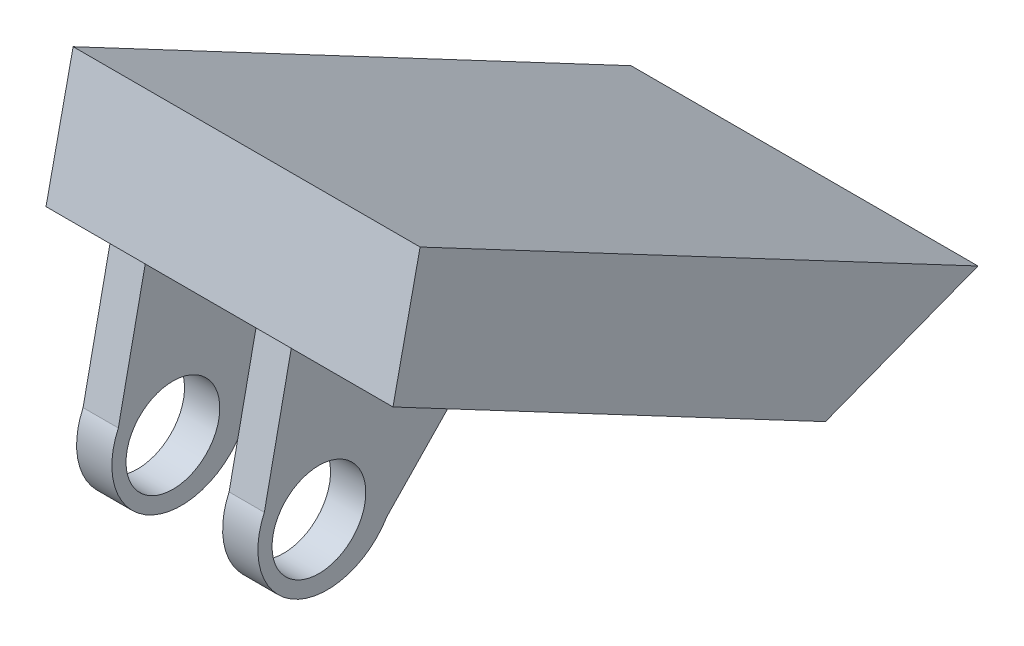
ISO-10303-21;
HEADER;
FILE_DESCRIPTION(('STEP AP214'),'2;1');
FILE_NAME('part.step','',(''),(''),'','','');
FILE_SCHEMA(('AUTOMOTIVE_DESIGN { 1 0 10303 214 1 1 1 1 }'));
ENDSEC;
DATA;
#1=APPLICATION_CONTEXT('core data for automotive mechanical design processes');
#2=APPLICATION_PROTOCOL_DEFINITION('international standard','automotive_design',2000,#1);
#3=PRODUCT_CONTEXT('',#1,'mechanical');
#4=PRODUCT('Part','Part','',(#3));
#5=PRODUCT_RELATED_PRODUCT_CATEGORY('part','',(#4));
#6=PRODUCT_DEFINITION_FORMATION('','',#4);
#7=PRODUCT_DEFINITION_CONTEXT('part definition',#1,'design');
#8=PRODUCT_DEFINITION('design','',#6,#7);
#9=PRODUCT_DEFINITION_SHAPE('','',#8);
#10=(LENGTH_UNIT() NAMED_UNIT(*) SI_UNIT(.MILLI.,.METRE.));
#11=(NAMED_UNIT(*) PLANE_ANGLE_UNIT() SI_UNIT($,.RADIAN.));
#12=(NAMED_UNIT(*) SI_UNIT($,.STERADIAN.) SOLID_ANGLE_UNIT());
#13=UNCERTAINTY_MEASURE_WITH_UNIT(LENGTH_MEASURE(1.E-05),#10,'distance_accuracy_value','');
#14=(GEOMETRIC_REPRESENTATION_CONTEXT(3) GLOBAL_UNCERTAINTY_ASSIGNED_CONTEXT((#13)) GLOBAL_UNIT_ASSIGNED_CONTEXT((#10,
#11,#12)) REPRESENTATION_CONTEXT('',''));
#15=CARTESIAN_POINT('',(0.,0.,0.));
#16=DIRECTION('',(0.,0.,1.));
#17=DIRECTION('',(1.,0.,0.));
#18=AXIS2_PLACEMENT_3D('',#15,#16,#17);
#19=CARTESIAN_POINT('',(140.024612,98.6155,-342.20531));
#20=DIRECTION('',(0.,0.883778488963269,-0.467905527265709));
#21=DIRECTION('',(0.,0.467905527265709,0.883778488963269));
#22=AXIS2_PLACEMENT_3D('',#19,#20,#21);
#23=PLANE('',#22);
#24=DIRECTION('',(0.,-0.467905527265709,-0.883778488963269));
#25=VECTOR('',#24,1.);
#26=CARTESIAN_POINT('',(119.09933,98.6155,-342.20531));
#27=LINE('',#26,#25);
#28=CARTESIAN_POINT('',(119.09933,136.241261767103,-271.137889456923));
#29=VERTEX_POINT('',#28);
#30=CARTESIAN_POINT('',(119.09933,118.763451398877,-304.149922736258));
#31=VERTEX_POINT('',#30);
#32=EDGE_CURVE('E40',#29,#31,#27,.T.);
#33=ORIENTED_EDGE('',*,*,#32,.T.);
#34=DIRECTION('',(-1.,0.,0.));
#35=VECTOR('',#34,1.);
#36=CARTESIAN_POINT('',(140.024612,118.763451398845,-304.149922736184));
#37=LINE('',#36,#35);
#38=CARTESIAN_POINT('',(113.00714,118.763451398877,-304.149922736258));
#39=VERTEX_POINT('',#38);
#40=EDGE_CURVE('E11',#31,#39,#37,.T.);
#41=ORIENTED_EDGE('',*,*,#40,.T.);
#42=DIRECTION('',(0.,-0.467905527265709,-0.883778488963269));
#43=VECTOR('',#42,1.);
#44=CARTESIAN_POINT('',(113.00714,98.6155,-342.20531));
#45=LINE('',#44,#43);
#46=CARTESIAN_POINT('',(113.00714,136.241261767111,-271.137889456938));
#47=VERTEX_POINT('',#46);
#48=EDGE_CURVE('E213',#47,#39,#45,.T.);
#49=ORIENTED_EDGE('',*,*,#48,.F.);
#50=DIRECTION('',(1.,0.,0.));
#51=VECTOR('',#50,1.);
#52=CARTESIAN_POINT('',(140.024612,136.241261767103,-271.137889456923));
#53=LINE('',#52,#51);
#54=EDGE_CURVE('E210',#47,#29,#53,.T.);
#55=ORIENTED_EDGE('',*,*,#54,.T.);
#56=EDGE_LOOP('',(#33,#41,#49,#55));
#57=FACE_BOUND('',#56,.T.);
#58=DIRECTION('',(0.,-0.467905527265709,-0.883778488963269));
#59=VECTOR('',#58,1.);
#60=CARTESIAN_POINT('',(80.083152,98.6155,-342.20531));
#61=LINE('',#60,#59);
#62=CARTESIAN_POINT('',(80.083152,138.173968,-267.4874));
#63=VERTEX_POINT('',#62);
#64=CARTESIAN_POINT('',(80.083152,98.6155,-342.20531));
#65=VERTEX_POINT('',#64);
#66=EDGE_CURVE('E171',#63,#65,#61,.T.);
#67=ORIENTED_EDGE('',*,*,#66,.T.);
#68=DIRECTION('',(-1.,0.,0.));
#69=VECTOR('',#68,1.);
#70=CARTESIAN_POINT('',(140.024612,98.6155,-342.20531));
#71=LINE('',#70,#69);
#72=CARTESIAN_POINT('',(140.024612,98.6155,-342.20531));
#73=VERTEX_POINT('',#72);
#74=EDGE_CURVE('E198',#73,#65,#71,.T.);
#75=ORIENTED_EDGE('',*,*,#74,.F.);
#76=DIRECTION('',(0.,-0.467905527265709,-0.883778488963269));
#77=VECTOR('',#76,1.);
#78=CARTESIAN_POINT('',(140.024612,98.6155,-342.20531));
#79=LINE('',#78,#77);
#80=CARTESIAN_POINT('',(140.024612,138.173968,-267.4874));
#81=VERTEX_POINT('',#80);
#82=EDGE_CURVE('E172',#81,#73,#79,.T.);
#83=ORIENTED_EDGE('',*,*,#82,.F.);
#84=DIRECTION('',(-1.,0.,0.));
#85=VECTOR('',#84,1.);
#86=CARTESIAN_POINT('',(140.024612,138.173968,-267.4874));
#87=LINE('',#86,#85);
#88=EDGE_CURVE('E182',#81,#63,#87,.T.);
#89=ORIENTED_EDGE('',*,*,#88,.T.);
#90=EDGE_LOOP('',(#67,#75,#83,#89));
#91=FACE_BOUND('',#90,.T.);
#92=DIRECTION('',(-1.,0.,0.));
#93=VECTOR('',#92,1.);
#94=CARTESIAN_POINT('',(140.024612,136.241261767115,-271.137889456901));
#95=LINE('',#94,#93);
#96=CARTESIAN_POINT('',(93.871034,136.241261767115,-271.137889456901));
#97=VERTEX_POINT('',#96);
#98=CARTESIAN_POINT('',(87.778844,136.241261767115,-271.137889456901));
#99=VERTEX_POINT('',#98);
#100=EDGE_CURVE('E55',#97,#99,#95,.T.);
#101=ORIENTED_EDGE('',*,*,#100,.F.);
#102=DIRECTION('',(0.,-0.467905527265709,-0.883778488963269));
#103=VECTOR('',#102,1.);
#104=CARTESIAN_POINT('',(93.871034,98.6155,-342.20531));
#105=LINE('',#104,#103);
#106=CARTESIAN_POINT('',(93.871034,118.763451398839,-304.149922736195));
#107=VERTEX_POINT('',#106);
#108=EDGE_CURVE('E207',#97,#107,#105,.T.);
#109=ORIENTED_EDGE('',*,*,#108,.T.);
#110=DIRECTION('',(1.,0.,0.));
#111=VECTOR('',#110,1.);
#112=CARTESIAN_POINT('',(140.024612,118.763451398839,-304.149922736195));
#113=LINE('',#112,#111);
#114=CARTESIAN_POINT('',(87.778844,118.763451398839,-304.149922736195));
#115=VERTEX_POINT('',#114);
#116=EDGE_CURVE('E201',#115,#107,#113,.T.);
#117=ORIENTED_EDGE('',*,*,#116,.F.);
#118=DIRECTION('',(0.,-0.467905527265709,-0.883778488963269));
#119=VECTOR('',#118,1.);
#120=CARTESIAN_POINT('',(87.778844,98.6155,-342.20531));
#121=LINE('',#120,#119);
#122=EDGE_CURVE('E204',#99,#115,#121,.T.);
#123=ORIENTED_EDGE('',*,*,#122,.F.);
#124=EDGE_LOOP('',(#101,#109,#117,#123));
#125=FACE_BOUND('',#124,.T.);
#126=ADVANCED_FACE('F33',(#57,#91,#125),#23,.F.);
#127=CARTESIAN_POINT('',(140.024612,108.729526,-368.557048));
#128=DIRECTION('',(0.,0.933597712885683,0.358322913716975));
#129=DIRECTION('',(0.,-0.358322913716975,0.933597712885683));
#130=AXIS2_PLACEMENT_3D('',#127,#128,#129);
#131=PLANE('',#130);
#132=DIRECTION('',(0.,0.358322913716975,-0.933597712885683));
#133=VECTOR('',#132,1.);
#134=CARTESIAN_POINT('',(80.083152,108.729526,-368.557048));
#135=LINE('',#134,#133);
#136=CARTESIAN_POINT('',(80.083152,108.729526,-368.557048));
#137=VERTEX_POINT('',#136);
#138=EDGE_CURVE('E185',#65,#137,#135,.T.);
#139=ORIENTED_EDGE('',*,*,#138,.T.);
#140=DIRECTION('',(-1.,0.,0.));
#141=VECTOR('',#140,1.);
#142=CARTESIAN_POINT('',(140.024612,108.729526,-368.557048));
#143=LINE('',#142,#141);
#144=CARTESIAN_POINT('',(140.024612,108.729526,-368.557048));
#145=VERTEX_POINT('',#144);
#146=EDGE_CURVE('E195',#145,#137,#143,.T.);
#147=ORIENTED_EDGE('',*,*,#146,.F.);
#148=DIRECTION('',(0.,0.358322913716975,-0.933597712885683));
#149=VECTOR('',#148,1.);
#150=CARTESIAN_POINT('',(140.024612,108.729526,-368.557048));
#151=LINE('',#150,#149);
#152=EDGE_CURVE('E175',#73,#145,#151,.T.);
#153=ORIENTED_EDGE('',*,*,#152,.F.);
#154=ORIENTED_EDGE('',*,*,#74,.T.);
#155=EDGE_LOOP('',(#139,#147,#153,#154));
#156=FACE_BOUND('',#155,.T.);
#157=ADVANCED_FACE('F251',(#156),#131,.F.);
#158=CARTESIAN_POINT('',(140.024612,159.761428,-272.174462));
#159=DIRECTION('',(0.,-0.883765821189431,0.467929453333909));
#160=DIRECTION('',(0.,-0.467929453333909,-0.883765821189431));
#161=AXIS2_PLACEMENT_3D('',#158,#159,#160);
#162=PLANE('',#161);
#163=DIRECTION('',(0.,0.467929453333909,0.883765821189431));
#164=VECTOR('',#163,1.);
#165=CARTESIAN_POINT('',(80.083152,159.761428,-272.174462));
#166=LINE('',#165,#164);
#167=CARTESIAN_POINT('',(80.083152,159.761428,-272.174462));
#168=VERTEX_POINT('',#167);
#169=EDGE_CURVE('E187',#137,#168,#166,.T.);
#170=ORIENTED_EDGE('',*,*,#169,.T.);
#171=DIRECTION('',(-1.,0.,0.));
#172=VECTOR('',#171,1.);
#173=CARTESIAN_POINT('',(140.024612,159.761428,-272.174462));
#174=LINE('',#173,#172);
#175=CARTESIAN_POINT('',(140.024612,159.761428,-272.174462));
#176=VERTEX_POINT('',#175);
#177=EDGE_CURVE('E192',#176,#168,#174,.T.);
#178=ORIENTED_EDGE('',*,*,#177,.F.);
#179=DIRECTION('',(0.,0.467929453333909,0.883765821189431));
#180=VECTOR('',#179,1.);
#181=CARTESIAN_POINT('',(140.024612,159.761428,-272.174462));
#182=LINE('',#181,#180);
#183=EDGE_CURVE('E178',#145,#176,#182,.T.);
#184=ORIENTED_EDGE('',*,*,#183,.F.);
#185=ORIENTED_EDGE('',*,*,#146,.T.);
#186=EDGE_LOOP('',(#170,#178,#184,#185));
#187=FACE_BOUND('',#186,.T.);
#188=ADVANCED_FACE('F255',(#187),#162,.F.);
#189=CARTESIAN_POINT('',(140.024612,138.173968,-267.4874));
#190=DIRECTION('',(0.,-0.212176158063372,-0.977231435203282));
#191=DIRECTION('',(0.,0.977231435203282,-0.212176158063372));
#192=AXIS2_PLACEMENT_3D('',#189,#190,#191);
#193=PLANE('',#192);
#194=DIRECTION('',(0.,-0.977231435203282,0.212176158063373));
#195=VECTOR('',#194,1.);
#196=CARTESIAN_POINT('',(80.083152,138.173968,-267.4874));
#197=LINE('',#196,#195);
#198=EDGE_CURVE('E176',#168,#63,#197,.T.);
#199=ORIENTED_EDGE('',*,*,#198,.T.);
#200=ORIENTED_EDGE('',*,*,#88,.F.);
#201=DIRECTION('',(0.,-0.977231435203282,0.212176158063373));
#202=VECTOR('',#201,1.);
#203=CARTESIAN_POINT('',(140.024612,138.173968,-267.4874));
#204=LINE('',#203,#202);
#205=EDGE_CURVE('E180',#176,#81,#204,.T.);
#206=ORIENTED_EDGE('',*,*,#205,.F.);
#207=ORIENTED_EDGE('',*,*,#177,.T.);
#208=EDGE_LOOP('',(#199,#200,#206,#207));
#209=FACE_BOUND('',#208,.T.);
#210=ADVANCED_FACE('F260',(#209),#193,.F.);
#211=CARTESIAN_POINT('',(140.024612,0.,0.));
#212=DIRECTION('',(-1.,0.,0.));
#213=DIRECTION('',(0.,0.,1.));
#214=AXIS2_PLACEMENT_3D('',#211,#212,#213);
#215=PLANE('',#214);
#216=ORIENTED_EDGE('',*,*,#82,.T.);
#217=ORIENTED_EDGE('',*,*,#152,.T.);
#218=ORIENTED_EDGE('',*,*,#183,.T.);
#219=ORIENTED_EDGE('',*,*,#205,.T.);
#220=EDGE_LOOP('',(#216,#217,#218,#219));
#221=FACE_BOUND('',#220,.T.);
#222=ADVANCED_FACE('F266',(#221),#215,.F.);
#223=CARTESIAN_POINT('',(80.083152,0.,0.));
#224=DIRECTION('',(-1.,0.,0.));
#225=DIRECTION('',(0.,0.,1.));
#226=AXIS2_PLACEMENT_3D('',#223,#224,#225);
#227=PLANE('',#226);
#228=ORIENTED_EDGE('',*,*,#66,.F.);
#229=ORIENTED_EDGE('',*,*,#198,.F.);
#230=ORIENTED_EDGE('',*,*,#169,.F.);
#231=ORIENTED_EDGE('',*,*,#138,.F.);
#232=EDGE_LOOP('',(#228,#229,#230,#231));
#233=FACE_BOUND('',#232,.T.);
#234=ADVANCED_FACE('F268',(#233),#227,.T.);
#235=CARTESIAN_POINT('',(93.871034,107.542553692348,-277.07555041729));
#236=DIRECTION('',(1.,0.,0.));
#237=DIRECTION('',(0.,0.,-1.));
#238=AXIS2_PLACEMENT_3D('',#235,#236,#237);
#239=PLANE('',#238);
#240=CARTESIAN_POINT('',(93.871034,106.805984,-275.620988));
#241=DIRECTION('',(1.,0.,0.));
#242=DIRECTION('',(0.,0.,-1.));
#243=AXIS2_PLACEMENT_3D('',#240,#241,#242);
#244=CIRCLE('',#243,8.09993675450289);
#245=CARTESIAN_POINT('',(93.871034,106.805984,-267.521051245497));
#246=VERTEX_POINT('',#245);
#247=EDGE_CURVE('E144',#246,#246,#244,.T.);
#248=ORIENTED_EDGE('',*,*,#247,.F.);
#249=EDGE_LOOP('',(#248));
#250=FACE_BOUND('',#249,.T.);
#251=ORIENTED_EDGE('',*,*,#108,.F.);
#252=DIRECTION('',(0.,-0.978831593947413,0.204667317103552));
#253=VECTOR('',#252,1.);
#254=CARTESIAN_POINT('',(93.871034,136.721088,-271.238218));
#255=LINE('',#254,#253);
#256=CARTESIAN_POINT('',(93.871034,112.593374,-266.19327));
#257=VERTEX_POINT('',#256);
#258=EDGE_CURVE('E152',#97,#257,#255,.T.);
#259=ORIENTED_EDGE('',*,*,#258,.T.);
#260=CARTESIAN_POINT('',(93.871034,107.542553692348,-277.07555041729));
#261=DIRECTION('',(1.,0.,0.));
#262=DIRECTION('',(0.,0.,-1.));
#263=AXIS2_PLACEMENT_3D('',#260,#261,#262);
#264=CIRCLE('',#263,11.9972835617371);
#265=CARTESIAN_POINT('',(93.871034,101.381052,-287.369758));
#266=VERTEX_POINT('',#265);
#267=EDGE_CURVE('E154',#257,#266,#264,.T.);
#268=ORIENTED_EDGE('',*,*,#267,.T.);
#269=DIRECTION('',(0.,0.719460228572206,-0.694533641735826));
#270=VECTOR('',#269,1.);
#271=CARTESIAN_POINT('',(93.871034,119.115332,-304.489612));
#272=LINE('',#271,#270);
#273=EDGE_CURVE('E157',#266,#107,#272,.T.);
#274=ORIENTED_EDGE('',*,*,#273,.T.);
#275=EDGE_LOOP('',(#251,#259,#268,#274));
#276=FACE_BOUND('',#275,.T.);
#277=ADVANCED_FACE('F271',(#250,#276),#239,.T.);
#278=CARTESIAN_POINT('',(87.778844,107.542553692348,-277.07555041729));
#279=DIRECTION('',(1.,0.,0.));
#280=DIRECTION('',(0.,0.,-1.));
#281=AXIS2_PLACEMENT_3D('',#278,#279,#280);
#282=PLANE('',#281);
#283=CARTESIAN_POINT('',(87.778844,106.805984,-275.620988));
#284=DIRECTION('',(1.,0.,0.));
#285=DIRECTION('',(0.,0.,-1.));
#286=AXIS2_PLACEMENT_3D('',#283,#284,#285);
#287=CIRCLE('',#286,8.09993675450289);
#288=CARTESIAN_POINT('',(87.778844,106.805984,-267.521051245497));
#289=VERTEX_POINT('',#288);
#290=EDGE_CURVE('E140',#289,#289,#287,.T.);
#291=ORIENTED_EDGE('',*,*,#290,.T.);
#292=EDGE_LOOP('',(#291));
#293=FACE_BOUND('',#292,.T.);
#294=DIRECTION('',(0.,-0.978831593947413,0.204667317103552));
#295=VECTOR('',#294,1.);
#296=CARTESIAN_POINT('',(87.778844,136.721088,-271.238218));
#297=LINE('',#296,#295);
#298=CARTESIAN_POINT('',(87.778844,112.593374,-266.19327));
#299=VERTEX_POINT('',#298);
#300=EDGE_CURVE('E150',#99,#299,#297,.T.);
#301=ORIENTED_EDGE('',*,*,#300,.F.);
#302=ORIENTED_EDGE('',*,*,#122,.T.);
#303=DIRECTION('',(0.,0.719460228572206,-0.694533641735826));
#304=VECTOR('',#303,1.);
#305=CARTESIAN_POINT('',(87.778844,119.115332,-304.489612));
#306=LINE('',#305,#304);
#307=CARTESIAN_POINT('',(87.778844,101.381052,-287.369758));
#308=VERTEX_POINT('',#307);
#309=EDGE_CURVE('E155',#308,#115,#306,.T.);
#310=ORIENTED_EDGE('',*,*,#309,.F.);
#311=CARTESIAN_POINT('',(87.778844,107.542553692348,-277.07555041729));
#312=DIRECTION('',(1.,0.,0.));
#313=DIRECTION('',(0.,0.,-1.));
#314=AXIS2_PLACEMENT_3D('',#311,#312,#313);
#315=CIRCLE('',#314,11.9972835617371);
#316=EDGE_CURVE('E162',#299,#308,#315,.T.);
#317=ORIENTED_EDGE('',*,*,#316,.F.);
#318=EDGE_LOOP('',(#301,#302,#310,#317));
#319=FACE_BOUND('',#318,.T.);
#320=ADVANCED_FACE('F280',(#293,#319),#282,.F.);
#321=CARTESIAN_POINT('',(93.871034,136.721088,-271.238218));
#322=DIRECTION('',(0.,-0.204667317103552,-0.978831593947413));
#323=DIRECTION('',(0.,0.978831593947414,-0.204667317103552));
#324=AXIS2_PLACEMENT_3D('',#321,#322,#323);
#325=PLANE('',#324);
#326=ORIENTED_EDGE('',*,*,#258,.F.);
#327=ORIENTED_EDGE('',*,*,#100,.T.);
#328=ORIENTED_EDGE('',*,*,#300,.T.);
#329=DIRECTION('',(-1.,0.,0.));
#330=VECTOR('',#329,1.);
#331=CARTESIAN_POINT('',(93.871034,112.593374,-266.19327));
#332=LINE('',#331,#330);
#333=EDGE_CURVE('E168',#257,#299,#332,.T.);
#334=ORIENTED_EDGE('',*,*,#333,.F.);
#335=EDGE_LOOP('',(#326,#327,#328,#334));
#336=FACE_BOUND('',#335,.T.);
#337=ADVANCED_FACE('F276',(#336),#325,.F.);
#338=CARTESIAN_POINT('',(93.871034,119.115332,-304.489612));
#339=DIRECTION('',(0.,0.694533641735826,0.719460228572206));
#340=DIRECTION('',(0.,-0.719460228572206,0.694533641735826));
#341=AXIS2_PLACEMENT_3D('',#338,#339,#340);
#342=PLANE('',#341);
#343=ORIENTED_EDGE('',*,*,#309,.T.);
#344=ORIENTED_EDGE('',*,*,#116,.T.);
#345=ORIENTED_EDGE('',*,*,#273,.F.);
#346=DIRECTION('',(-1.,0.,0.));
#347=VECTOR('',#346,1.);
#348=CARTESIAN_POINT('',(93.871034,101.381052,-287.369758));
#349=LINE('',#348,#347);
#350=EDGE_CURVE('E160',#266,#308,#349,.T.);
#351=ORIENTED_EDGE('',*,*,#350,.T.);
#352=EDGE_LOOP('',(#343,#344,#345,#351));
#353=FACE_BOUND('',#352,.T.);
#354=ADVANCED_FACE('F279',(#353),#342,.F.);
#355=CARTESIAN_POINT('',(93.871034,107.542553692348,-277.07555041729));
#356=DIRECTION('',(-1.,0.,0.));
#357=DIRECTION('',(0.,0.,1.));
#358=AXIS2_PLACEMENT_3D('',#355,#356,#357);
#359=CYLINDRICAL_SURFACE('',#358,11.9972835617371);
#360=ORIENTED_EDGE('',*,*,#316,.T.);
#361=ORIENTED_EDGE('',*,*,#350,.F.);
#362=ORIENTED_EDGE('',*,*,#267,.F.);
#363=ORIENTED_EDGE('',*,*,#333,.T.);
#364=EDGE_LOOP('',(#360,#361,#362,#363));
#365=FACE_BOUND('',#364,.T.);
#366=ADVANCED_FACE('F246',(#365),#359,.T.);
#367=CARTESIAN_POINT('',(93.871034,106.805984,-275.620988));
#368=DIRECTION('',(-1.,0.,0.));
#369=DIRECTION('',(0.,0.,1.));
#370=AXIS2_PLACEMENT_3D('',#367,#368,#369);
#371=CYLINDRICAL_SURFACE('',#370,8.09993675450289);
#372=CARTESIAN_POINT('',(93.871034,106.805984,-267.521051245497));
#373=CARTESIAN_POINT('',(93.8075736875,106.805984,-267.521051245497));
#374=CARTESIAN_POINT('',(93.744113375,106.805984,-267.521051245497));
#375=CARTESIAN_POINT('',(93.61719275,106.805984,-267.521051245497));
#376=CARTESIAN_POINT('',(93.5537324375,106.805984,-267.521051245497));
#377=CARTESIAN_POINT('',(93.4268118125,106.805984,-267.521051245497));
#378=CARTESIAN_POINT('',(93.3633515,106.805984,-267.521051245497));
#379=CARTESIAN_POINT('',(93.236430875,106.805984,-267.521051245497));
#380=CARTESIAN_POINT('',(93.1729705625,106.805984,-267.521051245497));
#381=CARTESIAN_POINT('',(93.0460499375,106.805984,-267.521051245497));
#382=CARTESIAN_POINT('',(92.982589625,106.805984,-267.521051245497));
#383=CARTESIAN_POINT('',(92.855669,106.805984,-267.521051245497));
#384=CARTESIAN_POINT('',(92.7922086875,106.805984,-267.521051245497));
#385=CARTESIAN_POINT('',(92.6652880625,106.805984,-267.521051245497));
#386=CARTESIAN_POINT('',(92.60182775,106.805984,-267.521051245497));
#387=CARTESIAN_POINT('',(92.474907125,106.805984,-267.521051245497));
#388=CARTESIAN_POINT('',(92.4114468125,106.805984,-267.521051245497));
#389=CARTESIAN_POINT('',(92.2845261875,106.805984,-267.521051245497));
#390=CARTESIAN_POINT('',(92.221065875,106.805984,-267.521051245497));
#391=CARTESIAN_POINT('',(92.09414525,106.805984,-267.521051245497));
#392=CARTESIAN_POINT('',(92.0306849375,106.805984,-267.521051245497));
#393=CARTESIAN_POINT('',(91.9037643125,106.805984,-267.521051245497));
#394=CARTESIAN_POINT('',(91.840304,106.805984,-267.521051245497));
#395=CARTESIAN_POINT('',(91.713383375,106.805984,-267.521051245497));
#396=CARTESIAN_POINT('',(91.6499230625,106.805984,-267.521051245497));
#397=CARTESIAN_POINT('',(91.5230024375,106.805984,-267.521051245497));
#398=CARTESIAN_POINT('',(91.459542125,106.805984,-267.521051245497));
#399=CARTESIAN_POINT('',(91.3326215,106.805984,-267.521051245497));
#400=CARTESIAN_POINT('',(91.2691611875,106.805984,-267.521051245497));
#401=CARTESIAN_POINT('',(91.1422405625,106.805984,-267.521051245497));
#402=CARTESIAN_POINT('',(91.07878025,106.805984,-267.521051245497));
#403=CARTESIAN_POINT('',(90.951859625,106.805984,-267.521051245497));
#404=CARTESIAN_POINT('',(90.8883993125,106.805984,-267.521051245497));
#405=CARTESIAN_POINT('',(90.7614786875,106.805984,-267.521051245497));
#406=CARTESIAN_POINT('',(90.698018375,106.805984,-267.521051245497));
#407=CARTESIAN_POINT('',(90.57109775,106.805984,-267.521051245497));
#408=CARTESIAN_POINT('',(90.5076374375,106.805984,-267.521051245497));
#409=CARTESIAN_POINT('',(90.3807168125,106.805984,-267.521051245497));
#410=CARTESIAN_POINT('',(90.3172565,106.805984,-267.521051245497));
#411=CARTESIAN_POINT('',(90.190335875,106.805984,-267.521051245497));
#412=CARTESIAN_POINT('',(90.1268755625,106.805984,-267.521051245497));
#413=CARTESIAN_POINT('',(89.9999549375,106.805984,-267.521051245497));
#414=CARTESIAN_POINT('',(89.936494625,106.805984,-267.521051245497));
#415=CARTESIAN_POINT('',(89.809574,106.805984,-267.521051245497));
#416=CARTESIAN_POINT('',(89.7461136875,106.805984,-267.521051245497));
#417=CARTESIAN_POINT('',(89.6191930625,106.805984,-267.521051245497));
#418=CARTESIAN_POINT('',(89.55573275,106.805984,-267.521051245497));
#419=CARTESIAN_POINT('',(89.428812125,106.805984,-267.521051245497));
#420=CARTESIAN_POINT('',(89.3653518125,106.805984,-267.521051245497));
#421=CARTESIAN_POINT('',(89.2384311875,106.805984,-267.521051245497));
#422=CARTESIAN_POINT('',(89.174970875,106.805984,-267.521051245497));
#423=CARTESIAN_POINT('',(89.04805025,106.805984,-267.521051245497));
#424=CARTESIAN_POINT('',(88.9845899375,106.805984,-267.521051245497));
#425=CARTESIAN_POINT('',(88.8576693125,106.805984,-267.521051245497));
#426=CARTESIAN_POINT('',(88.794209,106.805984,-267.521051245497));
#427=CARTESIAN_POINT('',(88.667288375,106.805984,-267.521051245497));
#428=CARTESIAN_POINT('',(88.6038280625,106.805984,-267.521051245497));
#429=CARTESIAN_POINT('',(88.4769074375,106.805984,-267.521051245497));
#430=CARTESIAN_POINT('',(88.413447125,106.805984,-267.521051245497));
#431=CARTESIAN_POINT('',(88.2865265,106.805984,-267.521051245497));
#432=CARTESIAN_POINT('',(88.2230661875,106.805984,-267.521051245497));
#433=CARTESIAN_POINT('',(88.0961455625,106.805984,-267.521051245497));
#434=CARTESIAN_POINT('',(88.03268525,106.805984,-267.521051245497));
#435=CARTESIAN_POINT('',(87.905764625,106.805984,-267.521051245497));
#436=CARTESIAN_POINT('',(87.8423043125,106.805984,-267.521051245497));
#437=CARTESIAN_POINT('',(87.778844,106.805984,-267.521051245497));
#438=B_SPLINE_CURVE_WITH_KNOTS('',3,(#372,#373,#374,#375,#376,#377,#378,#379,#380,#381,#382,
#383,#384,#385,#386,#387,#388,#389,#390,#391,#392,#393,#394,#395,#396,#397,#398,#399,#400,#401,
#402,#403,#404,#405,#406,#407,#408,#409,#410,#411,#412,#413,#414,#415,#416,#417,#418,#419,#420,
#421,#422,#423,#424,#425,#426,#427,#428,#429,#430,#431,#432,#433,#434,#435,#436,#437),
.UNSPECIFIED.,.F.,.F.,(4,2,2,2,2,2,2,2,2,2,2,2,2,2,2,2,2,2,2,2,2,2,2,2,2,2,2,2,2,2,2,2,4),(0.,
0.190380937499998,0.380761874999996,0.571142812499995,0.761523749999993,0.951904687499991,
1.14228562499999,1.33266656249999,1.5230475,1.7134284375,1.903809375,2.09419031249999,
2.28457124999999,2.47495218749999,2.66533312499999,2.85571406249999,3.046095,3.2364759375,
3.426856875,3.61723781249999,3.80761874999999,3.99799968749999,4.18838062499999,
4.37876156249999,4.5691425,4.7595234375,4.94990437499999,5.14028531249999,5.33066624999999,
5.52104718749999,5.71142812499999,5.90180906249999,6.09219),.UNSPECIFIED.);
#439=EDGE_CURVE('BSEAM238',#246,#289,#438,.T.);
#440=ORIENTED_EDGE('',*,*,#247,.T.);
#441=ORIENTED_EDGE('',*,*,#290,.F.);
#442=ORIENTED_EDGE('',*,*,#439,.T.);
#443=ORIENTED_EDGE('',*,*,#439,.F.);
#444=EDGE_LOOP('',(#440,#442,#441,#443));
#445=FACE_BOUND('',#444,.T.);
#446=ADVANCED_FACE('F238',(#445),#371,.F.);
#447=CARTESIAN_POINT('',(119.09933,107.542553692348,-277.07555041729));
#448=DIRECTION('',(1.,0.,0.));
#449=DIRECTION('',(0.,0.,-1.));
#450=AXIS2_PLACEMENT_3D('',#447,#448,#449);
#451=PLANE('',#450);
#452=CARTESIAN_POINT('',(119.09933,106.805984,-275.620988));
#453=DIRECTION('',(1.,0.,0.));
#454=DIRECTION('',(0.,0.,-1.));
#455=AXIS2_PLACEMENT_3D('',#452,#453,#454);
#456=CIRCLE('',#455,8.09993675450289);
#457=CARTESIAN_POINT('',(119.09933,106.805984,-267.521051245497));
#458=VERTEX_POINT('',#457);
#459=EDGE_CURVE('E226',#458,#458,#456,.T.);
#460=ORIENTED_EDGE('',*,*,#459,.F.);
#461=EDGE_LOOP('',(#460));
#462=FACE_BOUND('',#461,.T.);
#463=ORIENTED_EDGE('',*,*,#32,.F.);
#464=DIRECTION('',(0.,0.978831593947413,-0.204667317103552));
#465=VECTOR('',#464,1.);
#466=CARTESIAN_POINT('',(119.09933,-359348.088460214,74894.696315236));
#467=LINE('',#466,#465);
#468=CARTESIAN_POINT('',(119.09933,112.593374000028,-266.193270000031));
#469=VERTEX_POINT('',#468);
#470=EDGE_CURVE('E47',#469,#29,#467,.T.);
#471=ORIENTED_EDGE('',*,*,#470,.F.);
#472=CARTESIAN_POINT('',(119.09933,107.542553692348,-277.07555041729));
#473=DIRECTION('',(1.,0.,0.));
#474=DIRECTION('',(0.,0.,-1.));
#475=AXIS2_PLACEMENT_3D('',#472,#473,#474);
#476=CIRCLE('',#475,11.9972835617371);
#477=CARTESIAN_POINT('',(119.09933,101.381052000022,-287.369758000068));
#478=VERTEX_POINT('',#477);
#479=EDGE_CURVE('E130',#469,#478,#476,.T.);
#480=ORIENTED_EDGE('',*,*,#479,.T.);
#481=DIRECTION('',(0.,-0.719460228572206,0.694533641735826));
#482=VECTOR('',#481,1.);
#483=CARTESIAN_POINT('',(119.09933,-350666.106514874,338327.345645823));
#484=LINE('',#483,#482);
#485=EDGE_CURVE('E121',#31,#478,#484,.T.);
#486=ORIENTED_EDGE('',*,*,#485,.F.);
#487=EDGE_LOOP('',(#463,#471,#480,#486));
#488=FACE_BOUND('',#487,.T.);
#489=ADVANCED_FACE('F133',(#462,#488),#451,.T.);
#490=CARTESIAN_POINT('',(113.00714,107.542553692348,-277.07555041729));
#491=DIRECTION('',(1.,0.,0.));
#492=DIRECTION('',(0.,0.,-1.));
#493=AXIS2_PLACEMENT_3D('',#490,#491,#492);
#494=PLANE('',#493);
#495=CARTESIAN_POINT('',(113.00714,106.805984,-275.620988));
#496=DIRECTION('',(1.,0.,0.));
#497=DIRECTION('',(0.,0.,-1.));
#498=AXIS2_PLACEMENT_3D('',#495,#496,#497);
#499=CIRCLE('',#498,8.09993675450289);
#500=CARTESIAN_POINT('',(113.00714,106.805984,-267.521051245497));
#501=VERTEX_POINT('',#500);
#502=EDGE_CURVE('E228',#501,#501,#499,.T.);
#503=ORIENTED_EDGE('',*,*,#502,.T.);
#504=EDGE_LOOP('',(#503));
#505=FACE_BOUND('',#504,.T.);
#506=DIRECTION('',(0.,0.978831593947413,-0.204667317103552));
#507=VECTOR('',#506,1.);
#508=CARTESIAN_POINT('',(113.00714,-359348.088460214,74894.696315236));
#509=LINE('',#508,#507);
#510=CARTESIAN_POINT('',(113.00714,112.593374000028,-266.193270000031));
#511=VERTEX_POINT('',#510);
#512=EDGE_CURVE('E135',#511,#47,#509,.T.);
#513=ORIENTED_EDGE('',*,*,#512,.T.);
#514=ORIENTED_EDGE('',*,*,#48,.T.);
#515=DIRECTION('',(0.,-0.719460228572206,0.694533641735826));
#516=VECTOR('',#515,1.);
#517=CARTESIAN_POINT('',(113.00714,-350666.106514874,338327.345645823));
#518=LINE('',#517,#516);
#519=CARTESIAN_POINT('',(113.00714,101.381052000022,-287.369758000068));
#520=VERTEX_POINT('',#519);
#521=EDGE_CURVE('E222',#39,#520,#518,.T.);
#522=ORIENTED_EDGE('',*,*,#521,.T.);
#523=CARTESIAN_POINT('',(113.00714,107.542553692348,-277.07555041729));
#524=DIRECTION('',(1.,0.,0.));
#525=DIRECTION('',(0.,0.,-1.));
#526=AXIS2_PLACEMENT_3D('',#523,#524,#525);
#527=CIRCLE('',#526,11.9972835617371);
#528=EDGE_CURVE('E139',#511,#520,#527,.T.);
#529=ORIENTED_EDGE('',*,*,#528,.F.);
#530=EDGE_LOOP('',(#513,#514,#522,#529));
#531=FACE_BOUND('',#530,.T.);
#532=ADVANCED_FACE('F221',(#505,#531),#494,.F.);
#533=CARTESIAN_POINT('',(119.09933,-350666.106514874,338327.345645823));
#534=DIRECTION('',(0.,-0.694533641735826,-0.719460228572206));
#535=DIRECTION('',(0.,0.719460228572206,-0.694533641735826));
#536=AXIS2_PLACEMENT_3D('',#533,#534,#535);
#537=PLANE('',#536);
#538=ORIENTED_EDGE('',*,*,#40,.F.);
#539=ORIENTED_EDGE('',*,*,#485,.T.);
#540=DIRECTION('',(-1.,0.,0.));
#541=VECTOR('',#540,1.);
#542=CARTESIAN_POINT('',(119.09933,101.381052000022,-287.369758000068));
#543=LINE('',#542,#541);
#544=EDGE_CURVE('E126',#478,#520,#543,.T.);
#545=ORIENTED_EDGE('',*,*,#544,.T.);
#546=ORIENTED_EDGE('',*,*,#521,.F.);
#547=EDGE_LOOP('',(#538,#539,#545,#546));
#548=FACE_BOUND('',#547,.T.);
#549=ADVANCED_FACE('F123',(#548),#537,.T.);
#550=CARTESIAN_POINT('',(119.09933,-359348.088460214,74894.696315236));
#551=DIRECTION('',(0.,0.204667317103552,0.978831593947413));
#552=DIRECTION('',(0.,-0.978831593947414,0.204667317103552));
#553=AXIS2_PLACEMENT_3D('',#550,#551,#552);
#554=PLANE('',#553);
#555=ORIENTED_EDGE('',*,*,#54,.F.);
#556=ORIENTED_EDGE('',*,*,#512,.F.);
#557=DIRECTION('',(-1.,0.,0.));
#558=VECTOR('',#557,1.);
#559=CARTESIAN_POINT('',(119.09933,112.593374000028,-266.193270000031));
#560=LINE('',#559,#558);
#561=EDGE_CURVE('E141',#469,#511,#560,.T.);
#562=ORIENTED_EDGE('',*,*,#561,.F.);
#563=ORIENTED_EDGE('',*,*,#470,.T.);
#564=EDGE_LOOP('',(#555,#556,#562,#563));
#565=FACE_BOUND('',#564,.T.);
#566=ADVANCED_FACE('F219',(#565),#554,.T.);
#567=CARTESIAN_POINT('',(119.09933,107.542553692348,-277.07555041729));
#568=DIRECTION('',(-1.,0.,0.));
#569=DIRECTION('',(0.,0.,1.));
#570=AXIS2_PLACEMENT_3D('',#567,#568,#569);
#571=CYLINDRICAL_SURFACE('',#570,11.9972835617371);
#572=ORIENTED_EDGE('',*,*,#528,.T.);
#573=ORIENTED_EDGE('',*,*,#544,.F.);
#574=ORIENTED_EDGE('',*,*,#479,.F.);
#575=ORIENTED_EDGE('',*,*,#561,.T.);
#576=EDGE_LOOP('',(#572,#573,#574,#575));
#577=FACE_BOUND('',#576,.T.);
#578=ADVANCED_FACE('F137',(#577),#571,.T.);
#579=CARTESIAN_POINT('',(119.09933,106.805984,-275.620988));
#580=DIRECTION('',(-1.,0.,0.));
#581=DIRECTION('',(0.,0.,1.));
#582=AXIS2_PLACEMENT_3D('',#579,#580,#581);
#583=CYLINDRICAL_SURFACE('',#582,8.09993675450289);
#584=CARTESIAN_POINT('',(119.09933,106.805984,-267.521051245497));
#585=CARTESIAN_POINT('',(119.0358696875,106.805984,-267.521051245497));
#586=CARTESIAN_POINT('',(118.972409375,106.805984,-267.521051245497));
#587=CARTESIAN_POINT('',(118.84548875,106.805984,-267.521051245497));
#588=CARTESIAN_POINT('',(118.7820284375,106.805984,-267.521051245497));
#589=CARTESIAN_POINT('',(118.6551078125,106.805984,-267.521051245497));
#590=CARTESIAN_POINT('',(118.5916475,106.805984,-267.521051245497));
#591=CARTESIAN_POINT('',(118.464726875,106.805984,-267.521051245497));
#592=CARTESIAN_POINT('',(118.4012665625,106.805984,-267.521051245497));
#593=CARTESIAN_POINT('',(118.2743459375,106.805984,-267.521051245497));
#594=CARTESIAN_POINT('',(118.210885625,106.805984,-267.521051245497));
#595=CARTESIAN_POINT('',(118.083965,106.805984,-267.521051245497));
#596=CARTESIAN_POINT('',(118.0205046875,106.805984,-267.521051245497));
#597=CARTESIAN_POINT('',(117.8935840625,106.805984,-267.521051245497));
#598=CARTESIAN_POINT('',(117.83012375,106.805984,-267.521051245497));
#599=CARTESIAN_POINT('',(117.703203125,106.805984,-267.521051245497));
#600=CARTESIAN_POINT('',(117.6397428125,106.805984,-267.521051245497));
#601=CARTESIAN_POINT('',(117.5128221875,106.805984,-267.521051245497));
#602=CARTESIAN_POINT('',(117.449361875,106.805984,-267.521051245497));
#603=CARTESIAN_POINT('',(117.32244125,106.805984,-267.521051245497));
#604=CARTESIAN_POINT('',(117.2589809375,106.805984,-267.521051245497));
#605=CARTESIAN_POINT('',(117.1320603125,106.805984,-267.521051245497));
#606=CARTESIAN_POINT('',(117.0686,106.805984,-267.521051245497));
#607=CARTESIAN_POINT('',(116.941679375,106.805984,-267.521051245497));
#608=CARTESIAN_POINT('',(116.8782190625,106.805984,-267.521051245497));
#609=CARTESIAN_POINT('',(116.7512984375,106.805984,-267.521051245497));
#610=CARTESIAN_POINT('',(116.687838125,106.805984,-267.521051245497));
#611=CARTESIAN_POINT('',(116.5609175,106.805984,-267.521051245497));
#612=CARTESIAN_POINT('',(116.4974571875,106.805984,-267.521051245497));
#613=CARTESIAN_POINT('',(116.3705365625,106.805984,-267.521051245497));
#614=CARTESIAN_POINT('',(116.30707625,106.805984,-267.521051245497));
#615=CARTESIAN_POINT('',(116.180155625,106.805984,-267.521051245497));
#616=CARTESIAN_POINT('',(116.1166953125,106.805984,-267.521051245497));
#617=CARTESIAN_POINT('',(115.9897746875,106.805984,-267.521051245497));
#618=CARTESIAN_POINT('',(115.926314375,106.805984,-267.521051245497));
#619=CARTESIAN_POINT('',(115.79939375,106.805984,-267.521051245497));
#620=CARTESIAN_POINT('',(115.7359334375,106.805984,-267.521051245497));
#621=CARTESIAN_POINT('',(115.6090128125,106.805984,-267.521051245497));
#622=CARTESIAN_POINT('',(115.5455525,106.805984,-267.521051245497));
#623=CARTESIAN_POINT('',(115.418631875,106.805984,-267.521051245497));
#624=CARTESIAN_POINT('',(115.3551715625,106.805984,-267.521051245497));
#625=CARTESIAN_POINT('',(115.2282509375,106.805984,-267.521051245497));
#626=CARTESIAN_POINT('',(115.164790625,106.805984,-267.521051245497));
#627=CARTESIAN_POINT('',(115.03787,106.805984,-267.521051245497));
#628=CARTESIAN_POINT('',(114.9744096875,106.805984,-267.521051245497));
#629=CARTESIAN_POINT('',(114.8474890625,106.805984,-267.521051245497));
#630=CARTESIAN_POINT('',(114.78402875,106.805984,-267.521051245497));
#631=CARTESIAN_POINT('',(114.657108125,106.805984,-267.521051245497));
#632=CARTESIAN_POINT('',(114.5936478125,106.805984,-267.521051245497));
#633=CARTESIAN_POINT('',(114.4667271875,106.805984,-267.521051245497));
#634=CARTESIAN_POINT('',(114.403266875,106.805984,-267.521051245497));
#635=CARTESIAN_POINT('',(114.27634625,106.805984,-267.521051245497));
#636=CARTESIAN_POINT('',(114.2128859375,106.805984,-267.521051245497));
#637=CARTESIAN_POINT('',(114.0859653125,106.805984,-267.521051245497));
#638=CARTESIAN_POINT('',(114.022505,106.805984,-267.521051245497));
#639=CARTESIAN_POINT('',(113.895584375,106.805984,-267.521051245497));
#640=CARTESIAN_POINT('',(113.8321240625,106.805984,-267.521051245497));
#641=CARTESIAN_POINT('',(113.7052034375,106.805984,-267.521051245497));
#642=CARTESIAN_POINT('',(113.641743125,106.805984,-267.521051245497));
#643=CARTESIAN_POINT('',(113.5148225,106.805984,-267.521051245497));
#644=CARTESIAN_POINT('',(113.4513621875,106.805984,-267.521051245497));
#645=CARTESIAN_POINT('',(113.3244415625,106.805984,-267.521051245497));
#646=CARTESIAN_POINT('',(113.26098125,106.805984,-267.521051245497));
#647=CARTESIAN_POINT('',(113.134060625,106.805984,-267.521051245497));
#648=CARTESIAN_POINT('',(113.0706003125,106.805984,-267.521051245497));
#649=CARTESIAN_POINT('',(113.00714,106.805984,-267.521051245497));
#650=B_SPLINE_CURVE_WITH_KNOTS('',3,(#584,#585,#586,#587,#588,#589,#590,#591,#592,#593,#594,
#595,#596,#597,#598,#599,#600,#601,#602,#603,#604,#605,#606,#607,#608,#609,#610,#611,#612,#613,
#614,#615,#616,#617,#618,#619,#620,#621,#622,#623,#624,#625,#626,#627,#628,#629,#630,#631,#632,
#633,#634,#635,#636,#637,#638,#639,#640,#641,#642,#643,#644,#645,#646,#647,#648,#649),
.UNSPECIFIED.,.F.,.F.,(4,2,2,2,2,2,2,2,2,2,2,2,2,2,2,2,2,2,2,2,2,2,2,2,2,2,2,2,2,2,2,2,4),(0.,
0.190380937499998,0.380761874999996,0.571142812499995,0.761523749999993,0.951904687499991,
1.14228562499999,1.33266656249999,1.52304749999999,1.7134284375,1.903809375,2.09419031249999,
2.28457124999999,2.47495218749999,2.66533312499999,2.85571406249999,3.04609499999998,
3.2364759375,3.426856875,3.61723781249999,3.80761874999999,3.99799968749999,4.18838062499999,
4.37876156249999,4.56914249999998,4.7595234375,4.94990437499999,5.14028531249999,
5.33066624999999,5.52104718749999,5.71142812499999,5.90180906249999,6.09218999999998),.UNSPECIFIED.);
#651=EDGE_CURVE('BSEAM234',#458,#501,#650,.T.);
#652=ORIENTED_EDGE('',*,*,#459,.T.);
#653=ORIENTED_EDGE('',*,*,#502,.F.);
#654=ORIENTED_EDGE('',*,*,#651,.T.);
#655=ORIENTED_EDGE('',*,*,#651,.F.);
#656=EDGE_LOOP('',(#652,#654,#653,#655));
#657=FACE_BOUND('',#656,.T.);
#658=ADVANCED_FACE('F234',(#657),#583,.F.);
#659=CLOSED_SHELL('',(#126,#157,#188,#210,#222,#234,#277,#320,#337,#354,#366,#446,#489,#532,
#549,#566,#578,#658));
#660=MANIFOLD_SOLID_BREP('B2',#659);
#661=ADVANCED_BREP_SHAPE_REPRESENTATION('',(#18,#660),#14);
#662=SHAPE_DEFINITION_REPRESENTATION(#9,#661);
ENDSEC;
END-ISO-10303-21;
